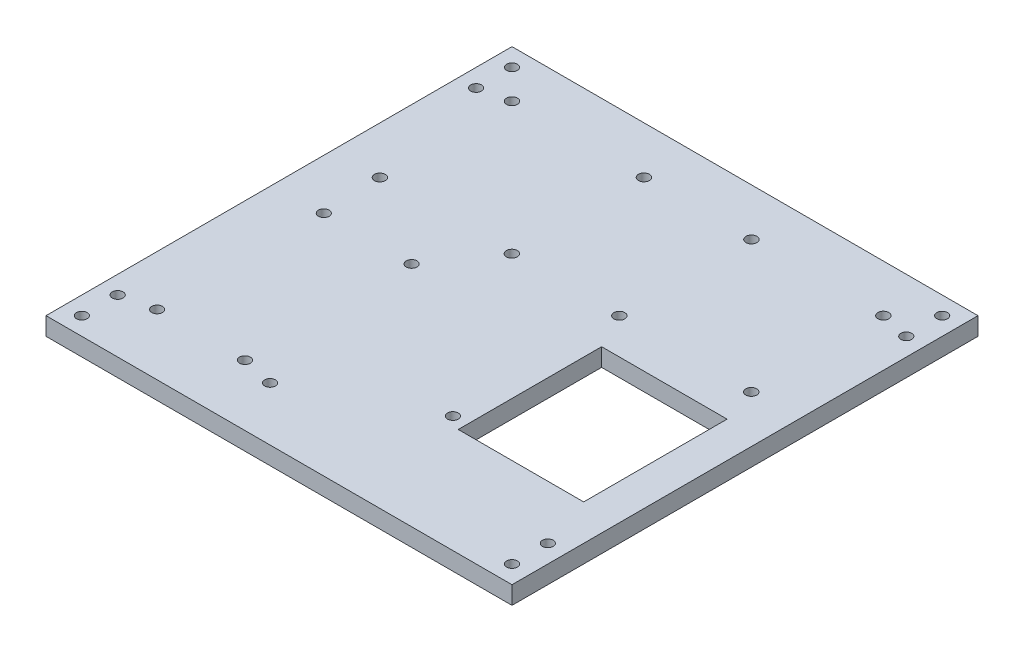
ISO-10303-21;
HEADER;
FILE_DESCRIPTION(('STEP AP214'),'2;1');
FILE_NAME('part.step','',(''),(''),'','','');
FILE_SCHEMA(('AUTOMOTIVE_DESIGN { 1 0 10303 214 1 1 1 1 }'));
ENDSEC;
DATA;
#1=APPLICATION_CONTEXT('core data for automotive mechanical design processes');
#2=APPLICATION_PROTOCOL_DEFINITION('international standard','automotive_design',2000,#1);
#3=PRODUCT_CONTEXT('',#1,'mechanical');
#4=PRODUCT('Part','Part','',(#3));
#5=PRODUCT_RELATED_PRODUCT_CATEGORY('part','',(#4));
#6=PRODUCT_DEFINITION_FORMATION('','',#4);
#7=PRODUCT_DEFINITION_CONTEXT('part definition',#1,'design');
#8=PRODUCT_DEFINITION('design','',#6,#7);
#9=PRODUCT_DEFINITION_SHAPE('','',#8);
#10=(LENGTH_UNIT() NAMED_UNIT(*) SI_UNIT(.MILLI.,.METRE.));
#11=(NAMED_UNIT(*) PLANE_ANGLE_UNIT() SI_UNIT($,.RADIAN.));
#12=(NAMED_UNIT(*) SI_UNIT($,.STERADIAN.) SOLID_ANGLE_UNIT());
#13=UNCERTAINTY_MEASURE_WITH_UNIT(LENGTH_MEASURE(1.E-05),#10,'distance_accuracy_value','');
#14=(GEOMETRIC_REPRESENTATION_CONTEXT(3) GLOBAL_UNCERTAINTY_ASSIGNED_CONTEXT((#13)) GLOBAL_UNIT_ASSIGNED_CONTEXT((#10,
#11,#12)) REPRESENTATION_CONTEXT('',''));
#15=CARTESIAN_POINT('',(0.,0.,0.));
#16=DIRECTION('',(0.,0.,1.));
#17=DIRECTION('',(1.,0.,0.));
#18=AXIS2_PLACEMENT_3D('',#15,#16,#17);
#19=CARTESIAN_POINT('',(65.,5.,-65.));
#20=DIRECTION('',(-1.,0.,0.));
#21=DIRECTION('',(0.,0.,1.));
#22=AXIS2_PLACEMENT_3D('',#19,#20,#21);
#23=PLANE('',#22);
#24=DIRECTION('',(0.,0.,-1.));
#25=VECTOR('',#24,1.);
#26=CARTESIAN_POINT('',(65.,0.,-65.));
#27=LINE('',#26,#25);
#28=CARTESIAN_POINT('',(65.,0.,65.));
#29=VERTEX_POINT('',#28);
#30=CARTESIAN_POINT('',(65.,0.,-65.));
#31=VERTEX_POINT('',#30);
#32=EDGE_CURVE('E176',#29,#31,#27,.T.);
#33=ORIENTED_EDGE('',*,*,#32,.T.);
#34=DIRECTION('',(0.,-1.,0.));
#35=VECTOR('',#34,1.);
#36=CARTESIAN_POINT('',(65.,5.,-65.));
#37=LINE('',#36,#35);
#38=CARTESIAN_POINT('',(65.,5.,-65.));
#39=VERTEX_POINT('',#38);
#40=EDGE_CURVE('E11',#39,#31,#37,.T.);
#41=ORIENTED_EDGE('',*,*,#40,.F.);
#42=DIRECTION('',(0.,0.,-1.));
#43=VECTOR('',#42,1.);
#44=CARTESIAN_POINT('',(65.,5.,-65.));
#45=LINE('',#44,#43);
#46=CARTESIAN_POINT('',(65.,5.,65.));
#47=VERTEX_POINT('',#46);
#48=EDGE_CURVE('E177',#47,#39,#45,.T.);
#49=ORIENTED_EDGE('',*,*,#48,.F.);
#50=DIRECTION('',(0.,-1.,0.));
#51=VECTOR('',#50,1.);
#52=CARTESIAN_POINT('',(65.,5.,65.));
#53=LINE('',#52,#51);
#54=EDGE_CURVE('E187',#47,#29,#53,.T.);
#55=ORIENTED_EDGE('',*,*,#54,.T.);
#56=EDGE_LOOP('',(#33,#41,#49,#55));
#57=FACE_BOUND('',#56,.T.);
#58=ADVANCED_FACE('F33',(#57),#23,.F.);
#59=CARTESIAN_POINT('',(-65.,5.,-65.));
#60=DIRECTION('',(0.,0.,1.));
#61=DIRECTION('',(1.,0.,0.));
#62=AXIS2_PLACEMENT_3D('',#59,#60,#61);
#63=PLANE('',#62);
#64=DIRECTION('',(-1.,0.,0.));
#65=VECTOR('',#64,1.);
#66=CARTESIAN_POINT('',(-65.,0.,-65.));
#67=LINE('',#66,#65);
#68=CARTESIAN_POINT('',(-65.,0.,-65.));
#69=VERTEX_POINT('',#68);
#70=EDGE_CURVE('E190',#31,#69,#67,.T.);
#71=ORIENTED_EDGE('',*,*,#70,.T.);
#72=DIRECTION('',(0.,-1.,0.));
#73=VECTOR('',#72,1.);
#74=CARTESIAN_POINT('',(-65.,5.,-65.));
#75=LINE('',#74,#73);
#76=CARTESIAN_POINT('',(-65.,5.,-65.));
#77=VERTEX_POINT('',#76);
#78=EDGE_CURVE('E40',#77,#69,#75,.T.);
#79=ORIENTED_EDGE('',*,*,#78,.F.);
#80=DIRECTION('',(-1.,0.,0.));
#81=VECTOR('',#80,1.);
#82=CARTESIAN_POINT('',(-65.,5.,-65.));
#83=LINE('',#82,#81);
#84=EDGE_CURVE('E180',#39,#77,#83,.T.);
#85=ORIENTED_EDGE('',*,*,#84,.F.);
#86=ORIENTED_EDGE('',*,*,#40,.T.);
#87=EDGE_LOOP('',(#71,#79,#85,#86));
#88=FACE_BOUND('',#87,.T.);
#89=ADVANCED_FACE('F219',(#88),#63,.F.);
#90=CARTESIAN_POINT('',(-65.,5.,-65.));
#91=DIRECTION('',(1.,0.,0.));
#92=DIRECTION('',(0.,0.,-1.));
#93=AXIS2_PLACEMENT_3D('',#90,#91,#92);
#94=PLANE('',#93);
#95=DIRECTION('',(0.,0.,1.));
#96=VECTOR('',#95,1.);
#97=CARTESIAN_POINT('',(-65.,0.,-65.));
#98=LINE('',#97,#96);
#99=CARTESIAN_POINT('',(-65.,0.,65.));
#100=VERTEX_POINT('',#99);
#101=EDGE_CURVE('E192',#69,#100,#98,.T.);
#102=ORIENTED_EDGE('',*,*,#101,.T.);
#103=DIRECTION('',(0.,-1.,0.));
#104=VECTOR('',#103,1.);
#105=CARTESIAN_POINT('',(-65.,5.,65.));
#106=LINE('',#105,#104);
#107=CARTESIAN_POINT('',(-65.,5.,65.));
#108=VERTEX_POINT('',#107);
#109=EDGE_CURVE('E197',#108,#100,#106,.T.);
#110=ORIENTED_EDGE('',*,*,#109,.F.);
#111=DIRECTION('',(0.,0.,1.));
#112=VECTOR('',#111,1.);
#113=CARTESIAN_POINT('',(-65.,5.,-65.));
#114=LINE('',#113,#112);
#115=EDGE_CURVE('E183',#77,#108,#114,.T.);
#116=ORIENTED_EDGE('',*,*,#115,.F.);
#117=ORIENTED_EDGE('',*,*,#78,.T.);
#118=EDGE_LOOP('',(#102,#110,#116,#117));
#119=FACE_BOUND('',#118,.T.);
#120=ADVANCED_FACE('F204',(#119),#94,.F.);
#121=CARTESIAN_POINT('',(-65.,5.,65.));
#122=DIRECTION('',(0.,0.,-1.));
#123=DIRECTION('',(-1.,0.,0.));
#124=AXIS2_PLACEMENT_3D('',#121,#122,#123);
#125=PLANE('',#124);
#126=DIRECTION('',(1.,0.,0.));
#127=VECTOR('',#126,1.);
#128=CARTESIAN_POINT('',(-65.,0.,65.));
#129=LINE('',#128,#127);
#130=EDGE_CURVE('E181',#100,#29,#129,.T.);
#131=ORIENTED_EDGE('',*,*,#130,.T.);
#132=ORIENTED_EDGE('',*,*,#54,.F.);
#133=DIRECTION('',(1.,0.,0.));
#134=VECTOR('',#133,1.);
#135=CARTESIAN_POINT('',(-65.,5.,65.));
#136=LINE('',#135,#134);
#137=EDGE_CURVE('E185',#108,#47,#136,.T.);
#138=ORIENTED_EDGE('',*,*,#137,.F.);
#139=ORIENTED_EDGE('',*,*,#109,.T.);
#140=EDGE_LOOP('',(#131,#132,#138,#139));
#141=FACE_BOUND('',#140,.T.);
#142=ADVANCED_FACE('F213',(#141),#125,.F.);
#143=CARTESIAN_POINT('',(0.,5.,0.));
#144=DIRECTION('',(0.,1.,0.));
#145=DIRECTION('',(0.,0.,1.));
#146=AXIS2_PLACEMENT_3D('',#143,#144,#145);
#147=PLANE('',#146);
#148=CARTESIAN_POINT('',(16.,5.,32.5));
#149=DIRECTION('',(0.,1.,0.));
#150=DIRECTION('',(0.,0.,1.));
#151=AXIS2_PLACEMENT_3D('',#148,#149,#150);
#152=CIRCLE('',#151,1.5);
#153=CARTESIAN_POINT('',(16.,5.,34.));
#154=VERTEX_POINT('',#153);
#155=EDGE_CURVE('E341',#154,#154,#152,.T.);
#156=ORIENTED_EDGE('',*,*,#155,.F.);
#157=EDGE_LOOP('',(#156));
#158=FACE_BOUND('',#157,.T.);
#159=CARTESIAN_POINT('',(-51.,5.,1.49999999999999));
#160=DIRECTION('',(0.,1.,0.));
#161=DIRECTION('',(0.,0.,1.));
#162=AXIS2_PLACEMENT_3D('',#159,#160,#161);
#163=CIRCLE('',#162,1.5);
#164=CARTESIAN_POINT('',(-51.,5.,2.99999999999999));
#165=VERTEX_POINT('',#164);
#166=EDGE_CURVE('E353',#165,#165,#163,.T.);
#167=ORIENTED_EDGE('',*,*,#166,.F.);
#168=EDGE_LOOP('',(#167));
#169=FACE_BOUND('',#168,.T.);
#170=CARTESIAN_POINT('',(-51.8036994219653,5.,-14.95));
#171=DIRECTION('',(0.,1.,0.));
#172=DIRECTION('',(0.,0.,1.));
#173=AXIS2_PLACEMENT_3D('',#170,#171,#172);
#174=CIRCLE('',#173,1.525);
#175=CARTESIAN_POINT('',(-51.8036994219653,5.,-13.425));
#176=VERTEX_POINT('',#175);
#177=EDGE_CURVE('E378',#176,#176,#174,.T.);
#178=ORIENTED_EDGE('',*,*,#177,.F.);
#179=EDGE_LOOP('',(#178));
#180=FACE_BOUND('',#179,.T.);
#181=CARTESIAN_POINT('',(-14.9963005780347,5.,-14.95));
#182=DIRECTION('',(0.,1.,0.));
#183=DIRECTION('',(0.,0.,1.));
#184=AXIS2_PLACEMENT_3D('',#181,#182,#183);
#185=CIRCLE('',#184,1.525);
#186=CARTESIAN_POINT('',(-14.9963005780347,5.,-13.425));
#187=VERTEX_POINT('',#186);
#188=EDGE_CURVE('E372',#187,#187,#185,.T.);
#189=ORIENTED_EDGE('',*,*,#188,.F.);
#190=EDGE_LOOP('',(#189));
#191=FACE_BOUND('',#190,.T.);
#192=CARTESIAN_POINT('',(14.9963005780347,5.,-14.9499999999999));
#193=DIRECTION('',(0.,1.,0.));
#194=DIRECTION('',(0.,0.,1.));
#195=AXIS2_PLACEMENT_3D('',#192,#193,#194);
#196=CIRCLE('',#195,1.525);
#197=CARTESIAN_POINT('',(14.9963005780347,5.,-13.4249999999999));
#198=VERTEX_POINT('',#197);
#199=EDGE_CURVE('E364',#198,#198,#196,.T.);
#200=ORIENTED_EDGE('',*,*,#199,.F.);
#201=EDGE_LOOP('',(#200));
#202=FACE_BOUND('',#201,.T.);
#203=CARTESIAN_POINT('',(51.8036994219653,5.,-14.9499999999999));
#204=DIRECTION('',(0.,1.,0.));
#205=DIRECTION('',(0.,0.,1.));
#206=AXIS2_PLACEMENT_3D('',#203,#204,#205);
#207=CIRCLE('',#206,1.525);
#208=CARTESIAN_POINT('',(51.8036994219653,5.,-13.425));
#209=VERTEX_POINT('',#208);
#210=EDGE_CURVE('E371',#209,#209,#207,.T.);
#211=ORIENTED_EDGE('',*,*,#210,.F.);
#212=EDGE_LOOP('',(#211));
#213=FACE_BOUND('',#212,.T.);
#214=CARTESIAN_POINT('',(51.8036994219653,5.,-51.7999999999999));
#215=DIRECTION('',(0.,1.,0.));
#216=DIRECTION('',(0.,0.,1.));
#217=AXIS2_PLACEMENT_3D('',#214,#215,#216);
#218=CIRCLE('',#217,1.525);
#219=CARTESIAN_POINT('',(51.8036994219653,5.,-50.2749999999999));
#220=VERTEX_POINT('',#219);
#221=EDGE_CURVE('E402',#220,#220,#218,.T.);
#222=ORIENTED_EDGE('',*,*,#221,.F.);
#223=EDGE_LOOP('',(#222));
#224=FACE_BOUND('',#223,.T.);
#225=CARTESIAN_POINT('',(14.9963005780347,5.,-51.7999999999999));
#226=DIRECTION('',(0.,1.,0.));
#227=DIRECTION('',(0.,0.,1.));
#228=AXIS2_PLACEMENT_3D('',#225,#226,#227);
#229=CIRCLE('',#228,1.525);
#230=CARTESIAN_POINT('',(14.9963005780347,5.,-50.2749999999999));
#231=VERTEX_POINT('',#230);
#232=EDGE_CURVE('E396',#231,#231,#229,.T.);
#233=ORIENTED_EDGE('',*,*,#232,.F.);
#234=EDGE_LOOP('',(#233));
#235=FACE_BOUND('',#234,.T.);
#236=CARTESIAN_POINT('',(-14.9963005780347,5.,-51.8));
#237=DIRECTION('',(0.,1.,0.));
#238=DIRECTION('',(0.,0.,1.));
#239=AXIS2_PLACEMENT_3D('',#236,#237,#238);
#240=CIRCLE('',#239,1.525);
#241=CARTESIAN_POINT('',(-14.9963005780347,5.,-50.275));
#242=VERTEX_POINT('',#241);
#243=EDGE_CURVE('E388',#242,#242,#240,.T.);
#244=ORIENTED_EDGE('',*,*,#243,.F.);
#245=EDGE_LOOP('',(#244));
#246=FACE_BOUND('',#245,.T.);
#247=CARTESIAN_POINT('',(-26.5,5.,1.49999999999999));
#248=DIRECTION('',(0.,1.,0.));
#249=DIRECTION('',(0.,0.,1.));
#250=AXIS2_PLACEMENT_3D('',#247,#248,#249);
#251=CIRCLE('',#250,1.5);
#252=CARTESIAN_POINT('',(-26.5,5.,3.));
#253=VERTEX_POINT('',#252);
#254=EDGE_CURVE('E346',#253,#253,#251,.T.);
#255=ORIENTED_EDGE('',*,*,#254,.F.);
#256=EDGE_LOOP('',(#255));
#257=FACE_BOUND('',#256,.T.);
#258=CARTESIAN_POINT('',(-26.5,5.,48.));
#259=DIRECTION('',(0.,1.,0.));
#260=DIRECTION('',(0.,0.,1.));
#261=AXIS2_PLACEMENT_3D('',#258,#259,#260);
#262=CIRCLE('',#261,1.5);
#263=CARTESIAN_POINT('',(-26.5,5.,49.5));
#264=VERTEX_POINT('',#263);
#265=EDGE_CURVE('E354',#264,#264,#262,.T.);
#266=ORIENTED_EDGE('',*,*,#265,.F.);
#267=EDGE_LOOP('',(#266));
#268=FACE_BOUND('',#267,.T.);
#269=CARTESIAN_POINT('',(-51.,5.,48.));
#270=DIRECTION('',(0.,1.,0.));
#271=DIRECTION('',(0.,0.,1.));
#272=AXIS2_PLACEMENT_3D('',#269,#270,#271);
#273=CIRCLE('',#272,1.49999999999998);
#274=CARTESIAN_POINT('',(-51.,5.,49.5));
#275=VERTEX_POINT('',#274);
#276=EDGE_CURVE('E343',#275,#275,#273,.T.);
#277=ORIENTED_EDGE('',*,*,#276,.F.);
#278=EDGE_LOOP('',(#277));
#279=FACE_BOUND('',#278,.T.);
#280=CARTESIAN_POINT('',(-51.8036994219653,5.,-51.8));
#281=DIRECTION('',(0.,1.,0.));
#282=DIRECTION('',(0.,0.,1.));
#283=AXIS2_PLACEMENT_3D('',#280,#281,#282);
#284=CIRCLE('',#283,1.525);
#285=CARTESIAN_POINT('',(-51.8036994219653,5.,-50.275));
#286=VERTEX_POINT('',#285);
#287=EDGE_CURVE('E395',#286,#286,#284,.T.);
#288=ORIENTED_EDGE('',*,*,#287,.F.);
#289=EDGE_LOOP('',(#288));
#290=FACE_BOUND('',#289,.T.);
#291=CARTESIAN_POINT('',(-17.5,5.,50.));
#292=DIRECTION('',(0.,1.,0.));
#293=DIRECTION('',(0.,0.,1.));
#294=AXIS2_PLACEMENT_3D('',#291,#292,#293);
#295=CIRCLE('',#294,1.5);
#296=CARTESIAN_POINT('',(-17.5,5.,51.5));
#297=VERTEX_POINT('',#296);
#298=EDGE_CURVE('E417',#297,#297,#295,.T.);
#299=ORIENTED_EDGE('',*,*,#298,.F.);
#300=EDGE_LOOP('',(#299));
#301=FACE_BOUND('',#300,.T.);
#302=DIRECTION('',(0.,0.,-1.));
#303=VECTOR('',#302,1.);
#304=CARTESIAN_POINT('',(55.,5.,-5.));
#305=LINE('',#304,#303);
#306=CARTESIAN_POINT('',(55.,5.,35.));
#307=VERTEX_POINT('',#306);
#308=CARTESIAN_POINT('',(55.,5.,-5.));
#309=VERTEX_POINT('',#308);
#310=EDGE_CURVE('E47',#307,#309,#305,.T.);
#311=ORIENTED_EDGE('',*,*,#310,.F.);
#312=DIRECTION('',(1.,0.,0.));
#313=VECTOR('',#312,1.);
#314=CARTESIAN_POINT('',(20.,5.,35.));
#315=LINE('',#314,#313);
#316=CARTESIAN_POINT('',(20.,5.,35.));
#317=VERTEX_POINT('',#316);
#318=EDGE_CURVE('E116',#317,#307,#315,.T.);
#319=ORIENTED_EDGE('',*,*,#318,.F.);
#320=DIRECTION('',(0.,0.,1.));
#321=VECTOR('',#320,1.);
#322=CARTESIAN_POINT('',(20.,5.,-5.));
#323=LINE('',#322,#321);
#324=CARTESIAN_POINT('',(20.,5.,-5.));
#325=VERTEX_POINT('',#324);
#326=EDGE_CURVE('E100',#325,#317,#323,.T.);
#327=ORIENTED_EDGE('',*,*,#326,.F.);
#328=DIRECTION('',(-1.,0.,0.));
#329=VECTOR('',#328,1.);
#330=CARTESIAN_POINT('',(20.,5.,-5.));
#331=LINE('',#330,#329);
#332=EDGE_CURVE('E109',#309,#325,#331,.T.);
#333=ORIENTED_EDGE('',*,*,#332,.F.);
#334=EDGE_LOOP('',(#311,#319,#327,#333));
#335=FACE_BOUND('',#334,.T.);
#336=CARTESIAN_POINT('',(-60.,5.,50.));
#337=DIRECTION('',(0.,1.,0.));
#338=DIRECTION('',(0.,0.,1.));
#339=AXIS2_PLACEMENT_3D('',#336,#337,#338);
#340=CIRCLE('',#339,1.49999999999999);
#341=CARTESIAN_POINT('',(-60.,5.,51.5));
#342=VERTEX_POINT('',#341);
#343=EDGE_CURVE('E127',#342,#342,#340,.T.);
#344=ORIENTED_EDGE('',*,*,#343,.F.);
#345=EDGE_LOOP('',(#344));
#346=FACE_BOUND('',#345,.T.);
#347=CARTESIAN_POINT('',(60.,5.,50.));
#348=DIRECTION('',(0.,1.,0.));
#349=DIRECTION('',(0.,0.,1.));
#350=AXIS2_PLACEMENT_3D('',#347,#348,#349);
#351=CIRCLE('',#350,1.5);
#352=CARTESIAN_POINT('',(60.,5.,51.5));
#353=VERTEX_POINT('',#352);
#354=EDGE_CURVE('E137',#353,#353,#351,.T.);
#355=ORIENTED_EDGE('',*,*,#354,.F.);
#356=EDGE_LOOP('',(#355));
#357=FACE_BOUND('',#356,.T.);
#358=CARTESIAN_POINT('',(60.,5.,-50.));
#359=DIRECTION('',(0.,1.,0.));
#360=DIRECTION('',(0.,0.,1.));
#361=AXIS2_PLACEMENT_3D('',#358,#359,#360);
#362=CIRCLE('',#361,1.5);
#363=CARTESIAN_POINT('',(60.,5.,-48.5));
#364=VERTEX_POINT('',#363);
#365=EDGE_CURVE('E129',#364,#364,#362,.T.);
#366=ORIENTED_EDGE('',*,*,#365,.F.);
#367=EDGE_LOOP('',(#366));
#368=FACE_BOUND('',#367,.T.);
#369=CARTESIAN_POINT('',(-60.,5.,-50.));
#370=DIRECTION('',(0.,1.,0.));
#371=DIRECTION('',(0.,0.,1.));
#372=AXIS2_PLACEMENT_3D('',#369,#370,#371);
#373=CIRCLE('',#372,1.49999999999999);
#374=CARTESIAN_POINT('',(-60.,5.,-48.5));
#375=VERTEX_POINT('',#374);
#376=EDGE_CURVE('E136',#375,#375,#373,.T.);
#377=ORIENTED_EDGE('',*,*,#376,.F.);
#378=EDGE_LOOP('',(#377));
#379=FACE_BOUND('',#378,.T.);
#380=CARTESIAN_POINT('',(-60.,5.,-60.));
#381=DIRECTION('',(0.,1.,0.));
#382=DIRECTION('',(0.,0.,-1.));
#383=AXIS2_PLACEMENT_3D('',#380,#381,#382);
#384=CIRCLE('',#383,1.5);
#385=CARTESIAN_POINT('',(-60.,5.,-61.5));
#386=VERTEX_POINT('',#385);
#387=EDGE_CURVE('E152',#386,#386,#384,.T.);
#388=ORIENTED_EDGE('',*,*,#387,.F.);
#389=EDGE_LOOP('',(#388));
#390=FACE_BOUND('',#389,.T.);
#391=CARTESIAN_POINT('',(-60.,5.,60.));
#392=DIRECTION('',(0.,1.,0.));
#393=DIRECTION('',(0.,0.,1.));
#394=AXIS2_PLACEMENT_3D('',#391,#392,#393);
#395=CIRCLE('',#394,1.5);
#396=CARTESIAN_POINT('',(-60.,5.,61.5));
#397=VERTEX_POINT('',#396);
#398=EDGE_CURVE('E161',#397,#397,#395,.T.);
#399=ORIENTED_EDGE('',*,*,#398,.F.);
#400=EDGE_LOOP('',(#399));
#401=FACE_BOUND('',#400,.T.);
#402=CARTESIAN_POINT('',(60.,5.,60.));
#403=DIRECTION('',(0.,1.,0.));
#404=DIRECTION('',(0.,0.,-1.));
#405=AXIS2_PLACEMENT_3D('',#402,#403,#404);
#406=CIRCLE('',#405,1.5);
#407=CARTESIAN_POINT('',(60.,5.,58.5));
#408=VERTEX_POINT('',#407);
#409=EDGE_CURVE('E153',#408,#408,#406,.T.);
#410=ORIENTED_EDGE('',*,*,#409,.F.);
#411=EDGE_LOOP('',(#410));
#412=FACE_BOUND('',#411,.T.);
#413=CARTESIAN_POINT('',(60.,5.,-60.));
#414=DIRECTION('',(0.,1.,0.));
#415=DIRECTION('',(0.,0.,1.));
#416=AXIS2_PLACEMENT_3D('',#413,#414,#415);
#417=CIRCLE('',#416,1.5);
#418=CARTESIAN_POINT('',(60.,5.,-58.5));
#419=VERTEX_POINT('',#418);
#420=EDGE_CURVE('E160',#419,#419,#417,.T.);
#421=ORIENTED_EDGE('',*,*,#420,.F.);
#422=EDGE_LOOP('',(#421));
#423=FACE_BOUND('',#422,.T.);
#424=ORIENTED_EDGE('',*,*,#48,.T.);
#425=ORIENTED_EDGE('',*,*,#84,.T.);
#426=ORIENTED_EDGE('',*,*,#115,.T.);
#427=ORIENTED_EDGE('',*,*,#137,.T.);
#428=EDGE_LOOP('',(#424,#425,#426,#427));
#429=FACE_BOUND('',#428,.T.);
#430=ADVANCED_FACE('F113',(#158,#169,#180,#191,#202,#213,#224,#235,#246,#257,#268,#279,#290,
#301,#335,#346,#357,#368,#379,#390,#401,#412,#423,#429),#147,.T.);
#431=CARTESIAN_POINT('',(0.,0.,0.));
#432=DIRECTION('',(0.,1.,0.));
#433=DIRECTION('',(0.,0.,1.));
#434=AXIS2_PLACEMENT_3D('',#431,#432,#433);
#435=PLANE('',#434);
#436=CARTESIAN_POINT('',(16.,0.,32.5));
#437=DIRECTION('',(0.,1.,0.));
#438=DIRECTION('',(0.,0.,1.));
#439=AXIS2_PLACEMENT_3D('',#436,#437,#438);
#440=CIRCLE('',#439,1.5);
#441=CARTESIAN_POINT('',(16.,0.,34.));
#442=VERTEX_POINT('',#441);
#443=EDGE_CURVE('E338',#442,#442,#440,.F.);
#444=ORIENTED_EDGE('',*,*,#443,.F.);
#445=EDGE_LOOP('',(#444));
#446=FACE_BOUND('',#445,.T.);
#447=CARTESIAN_POINT('',(-51.,0.,1.49999999999999));
#448=DIRECTION('',(0.,1.,0.));
#449=DIRECTION('',(0.,0.,1.));
#450=AXIS2_PLACEMENT_3D('',#447,#448,#449);
#451=CIRCLE('',#450,1.5);
#452=CARTESIAN_POINT('',(-51.,0.,2.99999999999999));
#453=VERTEX_POINT('',#452);
#454=EDGE_CURVE('E381',#453,#453,#451,.F.);
#455=ORIENTED_EDGE('',*,*,#454,.F.);
#456=EDGE_LOOP('',(#455));
#457=FACE_BOUND('',#456,.T.);
#458=CARTESIAN_POINT('',(-51.8036994219653,0.,-14.95));
#459=DIRECTION('',(0.,1.,0.));
#460=DIRECTION('',(0.,0.,1.));
#461=AXIS2_PLACEMENT_3D('',#458,#459,#460);
#462=CIRCLE('',#461,1.525);
#463=CARTESIAN_POINT('',(-51.8036994219653,0.,-13.425));
#464=VERTEX_POINT('',#463);
#465=EDGE_CURVE('E375',#464,#464,#462,.F.);
#466=ORIENTED_EDGE('',*,*,#465,.F.);
#467=EDGE_LOOP('',(#466));
#468=FACE_BOUND('',#467,.T.);
#469=CARTESIAN_POINT('',(-14.9963005780347,0.,-14.95));
#470=DIRECTION('',(0.,1.,0.));
#471=DIRECTION('',(0.,0.,1.));
#472=AXIS2_PLACEMENT_3D('',#469,#470,#471);
#473=CIRCLE('',#472,1.525);
#474=CARTESIAN_POINT('',(-14.9963005780347,0.,-13.425));
#475=VERTEX_POINT('',#474);
#476=EDGE_CURVE('E368',#475,#475,#473,.F.);
#477=ORIENTED_EDGE('',*,*,#476,.F.);
#478=EDGE_LOOP('',(#477));
#479=FACE_BOUND('',#478,.T.);
#480=CARTESIAN_POINT('',(14.9963005780347,0.,-14.9499999999999));
#481=DIRECTION('',(0.,1.,0.));
#482=DIRECTION('',(0.,0.,1.));
#483=AXIS2_PLACEMENT_3D('',#480,#481,#482);
#484=CIRCLE('',#483,1.525);
#485=CARTESIAN_POINT('',(14.9963005780347,0.,-13.4249999999999));
#486=VERTEX_POINT('',#485);
#487=EDGE_CURVE('E367',#486,#486,#484,.F.);
#488=ORIENTED_EDGE('',*,*,#487,.F.);
#489=EDGE_LOOP('',(#488));
#490=FACE_BOUND('',#489,.T.);
#491=CARTESIAN_POINT('',(51.8036994219653,0.,-14.9499999999999));
#492=DIRECTION('',(0.,1.,0.));
#493=DIRECTION('',(0.,0.,1.));
#494=AXIS2_PLACEMENT_3D('',#491,#492,#493);
#495=CIRCLE('',#494,1.525);
#496=CARTESIAN_POINT('',(51.8036994219653,0.,-13.425));
#497=VERTEX_POINT('',#496);
#498=EDGE_CURVE('E405',#497,#497,#495,.F.);
#499=ORIENTED_EDGE('',*,*,#498,.F.);
#500=EDGE_LOOP('',(#499));
#501=FACE_BOUND('',#500,.T.);
#502=CARTESIAN_POINT('',(51.8036994219653,0.,-51.7999999999999));
#503=DIRECTION('',(0.,1.,0.));
#504=DIRECTION('',(0.,0.,1.));
#505=AXIS2_PLACEMENT_3D('',#502,#503,#504);
#506=CIRCLE('',#505,1.525);
#507=CARTESIAN_POINT('',(51.8036994219653,0.,-50.2749999999999));
#508=VERTEX_POINT('',#507);
#509=EDGE_CURVE('E399',#508,#508,#506,.F.);
#510=ORIENTED_EDGE('',*,*,#509,.F.);
#511=EDGE_LOOP('',(#510));
#512=FACE_BOUND('',#511,.T.);
#513=CARTESIAN_POINT('',(14.9963005780347,0.,-51.7999999999999));
#514=DIRECTION('',(0.,1.,0.));
#515=DIRECTION('',(0.,0.,1.));
#516=AXIS2_PLACEMENT_3D('',#513,#514,#515);
#517=CIRCLE('',#516,1.525);
#518=CARTESIAN_POINT('',(14.9963005780347,0.,-50.2749999999999));
#519=VERTEX_POINT('',#518);
#520=EDGE_CURVE('E392',#519,#519,#517,.F.);
#521=ORIENTED_EDGE('',*,*,#520,.F.);
#522=EDGE_LOOP('',(#521));
#523=FACE_BOUND('',#522,.T.);
#524=CARTESIAN_POINT('',(-14.9963005780347,0.,-51.8));
#525=DIRECTION('',(0.,1.,0.));
#526=DIRECTION('',(0.,0.,1.));
#527=AXIS2_PLACEMENT_3D('',#524,#525,#526);
#528=CIRCLE('',#527,1.525);
#529=CARTESIAN_POINT('',(-14.9963005780347,0.,-50.275));
#530=VERTEX_POINT('',#529);
#531=EDGE_CURVE('E391',#530,#530,#528,.F.);
#532=ORIENTED_EDGE('',*,*,#531,.F.);
#533=EDGE_LOOP('',(#532));
#534=FACE_BOUND('',#533,.T.);
#535=CARTESIAN_POINT('',(-26.5,0.,1.49999999999999));
#536=DIRECTION('',(0.,1.,0.));
#537=DIRECTION('',(0.,0.,1.));
#538=AXIS2_PLACEMENT_3D('',#535,#536,#537);
#539=CIRCLE('',#538,1.5);
#540=CARTESIAN_POINT('',(-26.5,0.,3.));
#541=VERTEX_POINT('',#540);
#542=EDGE_CURVE('E349',#541,#541,#539,.F.);
#543=ORIENTED_EDGE('',*,*,#542,.F.);
#544=EDGE_LOOP('',(#543));
#545=FACE_BOUND('',#544,.T.);
#546=CARTESIAN_POINT('',(-26.5,0.,48.));
#547=DIRECTION('',(0.,1.,0.));
#548=DIRECTION('',(0.,0.,1.));
#549=AXIS2_PLACEMENT_3D('',#546,#547,#548);
#550=CIRCLE('',#549,1.5);
#551=CARTESIAN_POINT('',(-26.5,0.,49.5));
#552=VERTEX_POINT('',#551);
#553=EDGE_CURVE('E350',#552,#552,#550,.F.);
#554=ORIENTED_EDGE('',*,*,#553,.F.);
#555=EDGE_LOOP('',(#554));
#556=FACE_BOUND('',#555,.T.);
#557=CARTESIAN_POINT('',(-51.,0.,48.));
#558=DIRECTION('',(0.,1.,0.));
#559=DIRECTION('',(0.,0.,1.));
#560=AXIS2_PLACEMENT_3D('',#557,#558,#559);
#561=CIRCLE('',#560,1.49999999999998);
#562=CARTESIAN_POINT('',(-51.,0.,49.5));
#563=VERTEX_POINT('',#562);
#564=EDGE_CURVE('E357',#563,#563,#561,.F.);
#565=ORIENTED_EDGE('',*,*,#564,.F.);
#566=EDGE_LOOP('',(#565));
#567=FACE_BOUND('',#566,.T.);
#568=CARTESIAN_POINT('',(-51.8036994219653,0.,-51.8));
#569=DIRECTION('',(0.,1.,0.));
#570=DIRECTION('',(0.,0.,1.));
#571=AXIS2_PLACEMENT_3D('',#568,#569,#570);
#572=CIRCLE('',#571,1.525);
#573=CARTESIAN_POINT('',(-51.8036994219653,0.,-50.275));
#574=VERTEX_POINT('',#573);
#575=EDGE_CURVE('E414',#574,#574,#572,.F.);
#576=ORIENTED_EDGE('',*,*,#575,.F.);
#577=EDGE_LOOP('',(#576));
#578=FACE_BOUND('',#577,.T.);
#579=CARTESIAN_POINT('',(-17.5,0.,50.));
#580=DIRECTION('',(0.,1.,0.));
#581=DIRECTION('',(0.,0.,1.));
#582=AXIS2_PLACEMENT_3D('',#579,#580,#581);
#583=CIRCLE('',#582,1.5);
#584=CARTESIAN_POINT('',(-17.5,0.,51.5));
#585=VERTEX_POINT('',#584);
#586=EDGE_CURVE('E420',#585,#585,#583,.F.);
#587=ORIENTED_EDGE('',*,*,#586,.F.);
#588=EDGE_LOOP('',(#587));
#589=FACE_BOUND('',#588,.T.);
#590=DIRECTION('',(-1.,0.,0.));
#591=VECTOR('',#590,1.);
#592=CARTESIAN_POINT('',(20.,0.,35.));
#593=LINE('',#592,#591);
#594=CARTESIAN_POINT('',(55.,0.,35.));
#595=VERTEX_POINT('',#594);
#596=CARTESIAN_POINT('',(20.,0.,35.));
#597=VERTEX_POINT('',#596);
#598=EDGE_CURVE('E424',#595,#597,#593,.T.);
#599=ORIENTED_EDGE('',*,*,#598,.F.);
#600=DIRECTION('',(0.,0.,1.));
#601=VECTOR('',#600,1.);
#602=CARTESIAN_POINT('',(55.,0.,-5.));
#603=LINE('',#602,#601);
#604=CARTESIAN_POINT('',(55.,0.,-5.));
#605=VERTEX_POINT('',#604);
#606=EDGE_CURVE('E128',#605,#595,#603,.T.);
#607=ORIENTED_EDGE('',*,*,#606,.F.);
#608=DIRECTION('',(1.,0.,0.));
#609=VECTOR('',#608,1.);
#610=CARTESIAN_POINT('',(20.,0.,-5.));
#611=LINE('',#610,#609);
#612=CARTESIAN_POINT('',(20.,0.,-5.));
#613=VERTEX_POINT('',#612);
#614=EDGE_CURVE('E125',#613,#605,#611,.T.);
#615=ORIENTED_EDGE('',*,*,#614,.F.);
#616=DIRECTION('',(0.,0.,-1.));
#617=VECTOR('',#616,1.);
#618=CARTESIAN_POINT('',(20.,0.,-5.));
#619=LINE('',#618,#617);
#620=EDGE_CURVE('E103',#597,#613,#619,.T.);
#621=ORIENTED_EDGE('',*,*,#620,.F.);
#622=EDGE_LOOP('',(#599,#607,#615,#621));
#623=FACE_BOUND('',#622,.T.);
#624=CARTESIAN_POINT('',(-60.,0.,50.));
#625=DIRECTION('',(0.,1.,0.));
#626=DIRECTION('',(0.,0.,1.));
#627=AXIS2_PLACEMENT_3D('',#624,#625,#626);
#628=CIRCLE('',#627,1.49999999999999);
#629=CARTESIAN_POINT('',(-60.,0.,51.5));
#630=VERTEX_POINT('',#629);
#631=EDGE_CURVE('E140',#630,#630,#628,.F.);
#632=ORIENTED_EDGE('',*,*,#631,.F.);
#633=EDGE_LOOP('',(#632));
#634=FACE_BOUND('',#633,.T.);
#635=CARTESIAN_POINT('',(60.,0.,50.));
#636=DIRECTION('',(0.,1.,0.));
#637=DIRECTION('',(0.,0.,1.));
#638=AXIS2_PLACEMENT_3D('',#635,#636,#637);
#639=CIRCLE('',#638,1.5);
#640=CARTESIAN_POINT('',(60.,0.,51.5));
#641=VERTEX_POINT('',#640);
#642=EDGE_CURVE('E133',#641,#641,#639,.F.);
#643=ORIENTED_EDGE('',*,*,#642,.F.);
#644=EDGE_LOOP('',(#643));
#645=FACE_BOUND('',#644,.T.);
#646=CARTESIAN_POINT('',(60.,0.,-50.));
#647=DIRECTION('',(0.,1.,0.));
#648=DIRECTION('',(0.,0.,1.));
#649=AXIS2_PLACEMENT_3D('',#646,#647,#648);
#650=CIRCLE('',#649,1.5);
#651=CARTESIAN_POINT('',(60.,0.,-48.5));
#652=VERTEX_POINT('',#651);
#653=EDGE_CURVE('E132',#652,#652,#650,.F.);
#654=ORIENTED_EDGE('',*,*,#653,.F.);
#655=EDGE_LOOP('',(#654));
#656=FACE_BOUND('',#655,.T.);
#657=CARTESIAN_POINT('',(-60.,0.,-50.));
#658=DIRECTION('',(0.,1.,0.));
#659=DIRECTION('',(0.,0.,1.));
#660=AXIS2_PLACEMENT_3D('',#657,#658,#659);
#661=CIRCLE('',#660,1.49999999999999);
#662=CARTESIAN_POINT('',(-60.,0.,-48.5));
#663=VERTEX_POINT('',#662);
#664=EDGE_CURVE('E149',#663,#663,#661,.F.);
#665=ORIENTED_EDGE('',*,*,#664,.F.);
#666=EDGE_LOOP('',(#665));
#667=FACE_BOUND('',#666,.T.);
#668=CARTESIAN_POINT('',(-60.,0.,-60.));
#669=DIRECTION('',(0.,1.,0.));
#670=DIRECTION('',(0.,0.,1.));
#671=AXIS2_PLACEMENT_3D('',#668,#669,#670);
#672=CIRCLE('',#671,1.5);
#673=CARTESIAN_POINT('',(-60.,0.,-58.5));
#674=VERTEX_POINT('',#673);
#675=EDGE_CURVE('E164',#674,#674,#672,.F.);
#676=ORIENTED_EDGE('',*,*,#675,.F.);
#677=EDGE_LOOP('',(#676));
#678=FACE_BOUND('',#677,.T.);
#679=CARTESIAN_POINT('',(-60.,0.,60.));
#680=DIRECTION('',(0.,1.,0.));
#681=DIRECTION('',(0.,0.,1.));
#682=AXIS2_PLACEMENT_3D('',#679,#680,#681);
#683=CIRCLE('',#682,1.5);
#684=CARTESIAN_POINT('',(-60.,0.,61.5));
#685=VERTEX_POINT('',#684);
#686=EDGE_CURVE('E157',#685,#685,#683,.F.);
#687=ORIENTED_EDGE('',*,*,#686,.F.);
#688=EDGE_LOOP('',(#687));
#689=FACE_BOUND('',#688,.T.);
#690=CARTESIAN_POINT('',(60.,0.,60.));
#691=DIRECTION('',(0.,1.,0.));
#692=DIRECTION('',(0.,0.,1.));
#693=AXIS2_PLACEMENT_3D('',#690,#691,#692);
#694=CIRCLE('',#693,1.5);
#695=CARTESIAN_POINT('',(60.,0.,61.5));
#696=VERTEX_POINT('',#695);
#697=EDGE_CURVE('E156',#696,#696,#694,.F.);
#698=ORIENTED_EDGE('',*,*,#697,.F.);
#699=EDGE_LOOP('',(#698));
#700=FACE_BOUND('',#699,.T.);
#701=CARTESIAN_POINT('',(60.,0.,-60.));
#702=DIRECTION('',(0.,1.,0.));
#703=DIRECTION('',(0.,0.,1.));
#704=AXIS2_PLACEMENT_3D('',#701,#702,#703);
#705=CIRCLE('',#704,1.5);
#706=CARTESIAN_POINT('',(60.,0.,-58.5));
#707=VERTEX_POINT('',#706);
#708=EDGE_CURVE('E173',#707,#707,#705,.F.);
#709=ORIENTED_EDGE('',*,*,#708,.F.);
#710=EDGE_LOOP('',(#709));
#711=FACE_BOUND('',#710,.T.);
#712=ORIENTED_EDGE('',*,*,#32,.F.);
#713=ORIENTED_EDGE('',*,*,#130,.F.);
#714=ORIENTED_EDGE('',*,*,#101,.F.);
#715=ORIENTED_EDGE('',*,*,#70,.F.);
#716=EDGE_LOOP('',(#712,#713,#714,#715));
#717=FACE_BOUND('',#716,.T.);
#718=ADVANCED_FACE('F210',(#446,#457,#468,#479,#490,#501,#512,#523,#534,#545,#556,#567,#578,
#589,#623,#634,#645,#656,#667,#678,#689,#700,#711,#717),#435,.F.);
#719=CARTESIAN_POINT('',(60.,-4.24264068711927,-60.));
#720=DIRECTION('',(0.,1.,0.));
#721=DIRECTION('',(0.,0.,1.));
#722=AXIS2_PLACEMENT_3D('',#719,#720,#721);
#723=CYLINDRICAL_SURFACE('',#722,1.5);
#724=ORIENTED_EDGE('',*,*,#708,.T.);
#725=EDGE_LOOP('',(#724));
#726=FACE_BOUND('',#725,.T.);
#727=ORIENTED_EDGE('',*,*,#420,.T.);
#728=EDGE_LOOP('',(#727));
#729=FACE_BOUND('',#728,.T.);
#730=ADVANCED_FACE('F231',(#726,#729),#723,.F.);
#731=CARTESIAN_POINT('',(60.,-4.24264068711927,60.));
#732=DIRECTION('',(0.,1.,0.));
#733=DIRECTION('',(0.,0.,1.));
#734=AXIS2_PLACEMENT_3D('',#731,#732,#733);
#735=CYLINDRICAL_SURFACE('',#734,1.5);
#736=ORIENTED_EDGE('',*,*,#697,.T.);
#737=EDGE_LOOP('',(#736));
#738=FACE_BOUND('',#737,.T.);
#739=ORIENTED_EDGE('',*,*,#409,.T.);
#740=EDGE_LOOP('',(#739));
#741=FACE_BOUND('',#740,.T.);
#742=ADVANCED_FACE('F238',(#738,#741),#735,.F.);
#743=CARTESIAN_POINT('',(-60.,-4.24264068711927,60.));
#744=DIRECTION('',(0.,1.,0.));
#745=DIRECTION('',(0.,0.,1.));
#746=AXIS2_PLACEMENT_3D('',#743,#744,#745);
#747=CYLINDRICAL_SURFACE('',#746,1.5);
#748=ORIENTED_EDGE('',*,*,#686,.T.);
#749=EDGE_LOOP('',(#748));
#750=FACE_BOUND('',#749,.T.);
#751=ORIENTED_EDGE('',*,*,#398,.T.);
#752=EDGE_LOOP('',(#751));
#753=FACE_BOUND('',#752,.T.);
#754=ADVANCED_FACE('F244',(#750,#753),#747,.F.);
#755=CARTESIAN_POINT('',(-60.,-4.24264068711927,-60.));
#756=DIRECTION('',(0.,1.,0.));
#757=DIRECTION('',(0.,0.,1.));
#758=AXIS2_PLACEMENT_3D('',#755,#756,#757);
#759=CYLINDRICAL_SURFACE('',#758,1.5);
#760=ORIENTED_EDGE('',*,*,#675,.T.);
#761=EDGE_LOOP('',(#760));
#762=FACE_BOUND('',#761,.T.);
#763=ORIENTED_EDGE('',*,*,#387,.T.);
#764=EDGE_LOOP('',(#763));
#765=FACE_BOUND('',#764,.T.);
#766=ADVANCED_FACE('F240',(#762,#765),#759,.F.);
#767=CARTESIAN_POINT('',(-60.,-4.24264068711927,-50.));
#768=DIRECTION('',(0.,1.,0.));
#769=DIRECTION('',(0.,0.,1.));
#770=AXIS2_PLACEMENT_3D('',#767,#768,#769);
#771=CYLINDRICAL_SURFACE('',#770,1.49999999999999);
#772=ORIENTED_EDGE('',*,*,#664,.T.);
#773=EDGE_LOOP('',(#772));
#774=FACE_BOUND('',#773,.T.);
#775=ORIENTED_EDGE('',*,*,#376,.T.);
#776=EDGE_LOOP('',(#775));
#777=FACE_BOUND('',#776,.T.);
#778=ADVANCED_FACE('F243',(#774,#777),#771,.F.);
#779=CARTESIAN_POINT('',(60.,-4.24264068711927,-50.));
#780=DIRECTION('',(0.,1.,0.));
#781=DIRECTION('',(0.,0.,1.));
#782=AXIS2_PLACEMENT_3D('',#779,#780,#781);
#783=CYLINDRICAL_SURFACE('',#782,1.5);
#784=ORIENTED_EDGE('',*,*,#653,.T.);
#785=EDGE_LOOP('',(#784));
#786=FACE_BOUND('',#785,.T.);
#787=ORIENTED_EDGE('',*,*,#365,.T.);
#788=EDGE_LOOP('',(#787));
#789=FACE_BOUND('',#788,.T.);
#790=ADVANCED_FACE('F254',(#786,#789),#783,.F.);
#791=CARTESIAN_POINT('',(60.,-4.24264068711927,50.));
#792=DIRECTION('',(0.,1.,0.));
#793=DIRECTION('',(0.,0.,1.));
#794=AXIS2_PLACEMENT_3D('',#791,#792,#793);
#795=CYLINDRICAL_SURFACE('',#794,1.5);
#796=ORIENTED_EDGE('',*,*,#642,.T.);
#797=EDGE_LOOP('',(#796));
#798=FACE_BOUND('',#797,.T.);
#799=ORIENTED_EDGE('',*,*,#354,.T.);
#800=EDGE_LOOP('',(#799));
#801=FACE_BOUND('',#800,.T.);
#802=ADVANCED_FACE('F260',(#798,#801),#795,.F.);
#803=CARTESIAN_POINT('',(-60.,-4.24264068711927,50.));
#804=DIRECTION('',(0.,1.,0.));
#805=DIRECTION('',(0.,0.,1.));
#806=AXIS2_PLACEMENT_3D('',#803,#804,#805);
#807=CYLINDRICAL_SURFACE('',#806,1.49999999999999);
#808=ORIENTED_EDGE('',*,*,#631,.T.);
#809=EDGE_LOOP('',(#808));
#810=FACE_BOUND('',#809,.T.);
#811=ORIENTED_EDGE('',*,*,#343,.T.);
#812=EDGE_LOOP('',(#811));
#813=FACE_BOUND('',#812,.T.);
#814=ADVANCED_FACE('F256',(#810,#813),#807,.F.);
#815=CARTESIAN_POINT('',(55.,-53.1507290636733,-5.));
#816=DIRECTION('',(1.,0.,0.));
#817=DIRECTION('',(0.,0.,-1.));
#818=AXIS2_PLACEMENT_3D('',#815,#816,#817);
#819=PLANE('',#818);
#820=ORIENTED_EDGE('',*,*,#606,.T.);
#821=DIRECTION('',(0.,1.,0.));
#822=VECTOR('',#821,1.);
#823=CARTESIAN_POINT('',(55.,-53.1507290636733,35.));
#824=LINE('',#823,#822);
#825=EDGE_CURVE('E121',#595,#307,#824,.T.);
#826=ORIENTED_EDGE('',*,*,#825,.T.);
#827=ORIENTED_EDGE('',*,*,#310,.T.);
#828=DIRECTION('',(0.,1.,0.));
#829=VECTOR('',#828,1.);
#830=CARTESIAN_POINT('',(55.,-53.1507290636733,-5.));
#831=LINE('',#830,#829);
#832=EDGE_CURVE('E106',#605,#309,#831,.T.);
#833=ORIENTED_EDGE('',*,*,#832,.F.);
#834=EDGE_LOOP('',(#820,#826,#827,#833));
#835=FACE_BOUND('',#834,.T.);
#836=ADVANCED_FACE('F259',(#835),#819,.F.);
#837=CARTESIAN_POINT('',(20.,-53.1507290636733,35.));
#838=DIRECTION('',(0.,0.,1.));
#839=DIRECTION('',(1.,0.,0.));
#840=AXIS2_PLACEMENT_3D('',#837,#838,#839);
#841=PLANE('',#840);
#842=ORIENTED_EDGE('',*,*,#598,.T.);
#843=DIRECTION('',(0.,1.,0.));
#844=VECTOR('',#843,1.);
#845=CARTESIAN_POINT('',(20.,-53.1507290636733,35.));
#846=LINE('',#845,#844);
#847=EDGE_CURVE('E105',#597,#317,#846,.T.);
#848=ORIENTED_EDGE('',*,*,#847,.T.);
#849=ORIENTED_EDGE('',*,*,#318,.T.);
#850=ORIENTED_EDGE('',*,*,#825,.F.);
#851=EDGE_LOOP('',(#842,#848,#849,#850));
#852=FACE_BOUND('',#851,.T.);
#853=ADVANCED_FACE('F270',(#852),#841,.F.);
#854=CARTESIAN_POINT('',(20.,-53.1507290636733,-5.));
#855=DIRECTION('',(-1.,0.,0.));
#856=DIRECTION('',(0.,0.,1.));
#857=AXIS2_PLACEMENT_3D('',#854,#855,#856);
#858=PLANE('',#857);
#859=ORIENTED_EDGE('',*,*,#620,.T.);
#860=DIRECTION('',(0.,1.,0.));
#861=VECTOR('',#860,1.);
#862=CARTESIAN_POINT('',(20.,-53.1507290636733,-5.));
#863=LINE('',#862,#861);
#864=EDGE_CURVE('E55',#613,#325,#863,.T.);
#865=ORIENTED_EDGE('',*,*,#864,.T.);
#866=ORIENTED_EDGE('',*,*,#326,.T.);
#867=ORIENTED_EDGE('',*,*,#847,.F.);
#868=EDGE_LOOP('',(#859,#865,#866,#867));
#869=FACE_BOUND('',#868,.T.);
#870=ADVANCED_FACE('F97',(#869),#858,.F.);
#871=CARTESIAN_POINT('',(20.,-53.1507290636733,-5.));
#872=DIRECTION('',(0.,0.,-1.));
#873=DIRECTION('',(-1.,0.,0.));
#874=AXIS2_PLACEMENT_3D('',#871,#872,#873);
#875=PLANE('',#874);
#876=ORIENTED_EDGE('',*,*,#614,.T.);
#877=ORIENTED_EDGE('',*,*,#832,.T.);
#878=ORIENTED_EDGE('',*,*,#332,.T.);
#879=ORIENTED_EDGE('',*,*,#864,.F.);
#880=EDGE_LOOP('',(#876,#877,#878,#879));
#881=FACE_BOUND('',#880,.T.);
#882=ADVANCED_FACE('F110',(#881),#875,.F.);
#883=CARTESIAN_POINT('',(-17.5,-4.24264068711929,50.));
#884=DIRECTION('',(0.,1.,0.));
#885=DIRECTION('',(0.,0.,1.));
#886=AXIS2_PLACEMENT_3D('',#883,#884,#885);
#887=CYLINDRICAL_SURFACE('',#886,1.5);
#888=ORIENTED_EDGE('',*,*,#586,.T.);
#889=EDGE_LOOP('',(#888));
#890=FACE_BOUND('',#889,.T.);
#891=ORIENTED_EDGE('',*,*,#298,.T.);
#892=EDGE_LOOP('',(#891));
#893=FACE_BOUND('',#892,.T.);
#894=ADVANCED_FACE('F273',(#890,#893),#887,.F.);
#895=CARTESIAN_POINT('',(-51.8036994219653,-4.31335136523794,-51.8));
#896=DIRECTION('',(0.,1.,0.));
#897=DIRECTION('',(0.,0.,1.));
#898=AXIS2_PLACEMENT_3D('',#895,#896,#897);
#899=CYLINDRICAL_SURFACE('',#898,1.525);
#900=ORIENTED_EDGE('',*,*,#575,.T.);
#901=EDGE_LOOP('',(#900));
#902=FACE_BOUND('',#901,.T.);
#903=ORIENTED_EDGE('',*,*,#287,.T.);
#904=EDGE_LOOP('',(#903));
#905=FACE_BOUND('',#904,.T.);
#906=ADVANCED_FACE('F281',(#902,#905),#899,.F.);
#907=CARTESIAN_POINT('',(-51.,-4.31335136523794,48.));
#908=DIRECTION('',(0.,1.,0.));
#909=DIRECTION('',(0.,0.,1.));
#910=AXIS2_PLACEMENT_3D('',#907,#908,#909);
#911=CYLINDRICAL_SURFACE('',#910,1.49999999999998);
#912=ORIENTED_EDGE('',*,*,#564,.T.);
#913=EDGE_LOOP('',(#912));
#914=FACE_BOUND('',#913,.T.);
#915=ORIENTED_EDGE('',*,*,#276,.T.);
#916=EDGE_LOOP('',(#915));
#917=FACE_BOUND('',#916,.T.);
#918=ADVANCED_FACE('F285',(#914,#917),#911,.F.);
#919=CARTESIAN_POINT('',(-26.5,-4.31335136523794,48.));
#920=DIRECTION('',(0.,1.,0.));
#921=DIRECTION('',(0.,0.,1.));
#922=AXIS2_PLACEMENT_3D('',#919,#920,#921);
#923=CYLINDRICAL_SURFACE('',#922,1.5);
#924=ORIENTED_EDGE('',*,*,#553,.T.);
#925=EDGE_LOOP('',(#924));
#926=FACE_BOUND('',#925,.T.);
#927=ORIENTED_EDGE('',*,*,#265,.T.);
#928=EDGE_LOOP('',(#927));
#929=FACE_BOUND('',#928,.T.);
#930=ADVANCED_FACE('F323',(#926,#929),#923,.F.);
#931=CARTESIAN_POINT('',(-26.5,-4.31335136523794,1.49999999999999));
#932=DIRECTION('',(0.,1.,0.));
#933=DIRECTION('',(0.,0.,1.));
#934=AXIS2_PLACEMENT_3D('',#931,#932,#933);
#935=CYLINDRICAL_SURFACE('',#934,1.5);
#936=ORIENTED_EDGE('',*,*,#542,.T.);
#937=EDGE_LOOP('',(#936));
#938=FACE_BOUND('',#937,.T.);
#939=ORIENTED_EDGE('',*,*,#254,.T.);
#940=EDGE_LOOP('',(#939));
#941=FACE_BOUND('',#940,.T.);
#942=ADVANCED_FACE('F303',(#938,#941),#935,.F.);
#943=CARTESIAN_POINT('',(-14.9963005780347,-4.31335136523794,-51.8));
#944=DIRECTION('',(0.,1.,0.));
#945=DIRECTION('',(0.,0.,1.));
#946=AXIS2_PLACEMENT_3D('',#943,#944,#945);
#947=CYLINDRICAL_SURFACE('',#946,1.525);
#948=ORIENTED_EDGE('',*,*,#531,.T.);
#949=EDGE_LOOP('',(#948));
#950=FACE_BOUND('',#949,.T.);
#951=ORIENTED_EDGE('',*,*,#243,.T.);
#952=EDGE_LOOP('',(#951));
#953=FACE_BOUND('',#952,.T.);
#954=ADVANCED_FACE('F299',(#950,#953),#947,.F.);
#955=CARTESIAN_POINT('',(14.9963005780347,-4.31335136523794,-51.7999999999999));
#956=DIRECTION('',(0.,1.,0.));
#957=DIRECTION('',(0.,0.,1.));
#958=AXIS2_PLACEMENT_3D('',#955,#956,#957);
#959=CYLINDRICAL_SURFACE('',#958,1.525);
#960=ORIENTED_EDGE('',*,*,#520,.T.);
#961=EDGE_LOOP('',(#960));
#962=FACE_BOUND('',#961,.T.);
#963=ORIENTED_EDGE('',*,*,#232,.T.);
#964=EDGE_LOOP('',(#963));
#965=FACE_BOUND('',#964,.T.);
#966=ADVANCED_FACE('F295',(#962,#965),#959,.F.);
#967=CARTESIAN_POINT('',(51.8036994219653,-4.31335136523794,-51.7999999999999));
#968=DIRECTION('',(0.,1.,0.));
#969=DIRECTION('',(0.,0.,1.));
#970=AXIS2_PLACEMENT_3D('',#967,#968,#969);
#971=CYLINDRICAL_SURFACE('',#970,1.525);
#972=ORIENTED_EDGE('',*,*,#509,.T.);
#973=EDGE_LOOP('',(#972));
#974=FACE_BOUND('',#973,.T.);
#975=ORIENTED_EDGE('',*,*,#221,.T.);
#976=EDGE_LOOP('',(#975));
#977=FACE_BOUND('',#976,.T.);
#978=ADVANCED_FACE('F291',(#974,#977),#971,.F.);
#979=CARTESIAN_POINT('',(51.8036994219653,-4.31335136523794,-14.9499999999999));
#980=DIRECTION('',(0.,1.,0.));
#981=DIRECTION('',(0.,0.,1.));
#982=AXIS2_PLACEMENT_3D('',#979,#980,#981);
#983=CYLINDRICAL_SURFACE('',#982,1.525);
#984=ORIENTED_EDGE('',*,*,#498,.T.);
#985=EDGE_LOOP('',(#984));
#986=FACE_BOUND('',#985,.T.);
#987=ORIENTED_EDGE('',*,*,#210,.T.);
#988=EDGE_LOOP('',(#987));
#989=FACE_BOUND('',#988,.T.);
#990=ADVANCED_FACE('F287',(#986,#989),#983,.F.);
#991=CARTESIAN_POINT('',(14.9963005780347,-4.31335136523794,-14.9499999999999));
#992=DIRECTION('',(0.,1.,0.));
#993=DIRECTION('',(0.,0.,1.));
#994=AXIS2_PLACEMENT_3D('',#991,#992,#993);
#995=CYLINDRICAL_SURFACE('',#994,1.525);
#996=ORIENTED_EDGE('',*,*,#487,.T.);
#997=EDGE_LOOP('',(#996));
#998=FACE_BOUND('',#997,.T.);
#999=ORIENTED_EDGE('',*,*,#199,.T.);
#1000=EDGE_LOOP('',(#999));
#1001=FACE_BOUND('',#1000,.T.);
#1002=ADVANCED_FACE('F290',(#998,#1001),#995,.F.);
#1003=CARTESIAN_POINT('',(-14.9963005780347,-4.31335136523794,-14.95));
#1004=DIRECTION('',(0.,1.,0.));
#1005=DIRECTION('',(0.,0.,1.));
#1006=AXIS2_PLACEMENT_3D('',#1003,#1004,#1005);
#1007=CYLINDRICAL_SURFACE('',#1006,1.525);
#1008=ORIENTED_EDGE('',*,*,#476,.T.);
#1009=EDGE_LOOP('',(#1008));
#1010=FACE_BOUND('',#1009,.T.);
#1011=ORIENTED_EDGE('',*,*,#188,.T.);
#1012=EDGE_LOOP('',(#1011));
#1013=FACE_BOUND('',#1012,.T.);
#1014=ADVANCED_FACE('F313',(#1010,#1013),#1007,.F.);
#1015=CARTESIAN_POINT('',(-51.8036994219653,-4.31335136523794,-14.95));
#1016=DIRECTION('',(0.,1.,0.));
#1017=DIRECTION('',(0.,0.,1.));
#1018=AXIS2_PLACEMENT_3D('',#1015,#1016,#1017);
#1019=CYLINDRICAL_SURFACE('',#1018,1.525);
#1020=ORIENTED_EDGE('',*,*,#465,.T.);
#1021=EDGE_LOOP('',(#1020));
#1022=FACE_BOUND('',#1021,.T.);
#1023=ORIENTED_EDGE('',*,*,#177,.T.);
#1024=EDGE_LOOP('',(#1023));
#1025=FACE_BOUND('',#1024,.T.);
#1026=ADVANCED_FACE('F309',(#1022,#1025),#1019,.F.);
#1027=CARTESIAN_POINT('',(-51.,-4.31335136523794,1.49999999999999));
#1028=DIRECTION('',(0.,1.,0.));
#1029=DIRECTION('',(0.,0.,1.));
#1030=AXIS2_PLACEMENT_3D('',#1027,#1028,#1029);
#1031=CYLINDRICAL_SURFACE('',#1030,1.5);
#1032=ORIENTED_EDGE('',*,*,#454,.T.);
#1033=EDGE_LOOP('',(#1032));
#1034=FACE_BOUND('',#1033,.T.);
#1035=ORIENTED_EDGE('',*,*,#166,.T.);
#1036=EDGE_LOOP('',(#1035));
#1037=FACE_BOUND('',#1036,.T.);
#1038=ADVANCED_FACE('F305',(#1034,#1037),#1031,.F.);
#1039=CARTESIAN_POINT('',(16.,-4.2426406871193,32.5));
#1040=DIRECTION('',(0.,1.,0.));
#1041=DIRECTION('',(0.,0.,1.));
#1042=AXIS2_PLACEMENT_3D('',#1039,#1040,#1041);
#1043=CYLINDRICAL_SURFACE('',#1042,1.5);
#1044=CARTESIAN_POINT('',(16.,0.,34.));
#1045=CARTESIAN_POINT('',(16.,0.0520833333333334,34.));
#1046=CARTESIAN_POINT('',(16.,0.104166666666667,34.));
#1047=CARTESIAN_POINT('',(16.,0.208333333333334,34.));
#1048=CARTESIAN_POINT('',(16.,0.260416666666667,34.));
#1049=CARTESIAN_POINT('',(16.,0.364583333333333,34.));
#1050=CARTESIAN_POINT('',(16.,0.416666666666666,34.));
#1051=CARTESIAN_POINT('',(16.,0.520833333333333,34.));
#1052=CARTESIAN_POINT('',(16.,0.572916666666666,34.));
#1053=CARTESIAN_POINT('',(16.,0.677083333333333,34.));
#1054=CARTESIAN_POINT('',(16.,0.729166666666667,34.));
#1055=CARTESIAN_POINT('',(16.,0.833333333333333,34.));
#1056=CARTESIAN_POINT('',(16.,0.885416666666667,34.));
#1057=CARTESIAN_POINT('',(16.,0.989583333333333,34.));
#1058=CARTESIAN_POINT('',(16.,1.04166666666667,34.));
#1059=CARTESIAN_POINT('',(16.,1.14583333333333,34.));
#1060=CARTESIAN_POINT('',(16.,1.19791666666667,34.));
#1061=CARTESIAN_POINT('',(16.,1.30208333333333,34.));
#1062=CARTESIAN_POINT('',(16.,1.35416666666667,34.));
#1063=CARTESIAN_POINT('',(16.,1.45833333333333,34.));
#1064=CARTESIAN_POINT('',(16.,1.51041666666667,34.));
#1065=CARTESIAN_POINT('',(16.,1.61458333333333,34.));
#1066=CARTESIAN_POINT('',(16.,1.66666666666667,34.));
#1067=CARTESIAN_POINT('',(16.,1.77083333333333,34.));
#1068=CARTESIAN_POINT('',(16.,1.82291666666667,34.));
#1069=CARTESIAN_POINT('',(16.,1.92708333333333,34.));
#1070=CARTESIAN_POINT('',(16.,1.97916666666667,34.));
#1071=CARTESIAN_POINT('',(16.,2.08333333333333,34.));
#1072=CARTESIAN_POINT('',(16.,2.13541666666667,34.));
#1073=CARTESIAN_POINT('',(16.,2.23958333333333,34.));
#1074=CARTESIAN_POINT('',(16.,2.29166666666667,34.));
#1075=CARTESIAN_POINT('',(16.,2.39583333333333,34.));
#1076=CARTESIAN_POINT('',(16.,2.44791666666667,34.));
#1077=CARTESIAN_POINT('',(16.,2.55208333333333,34.));
#1078=CARTESIAN_POINT('',(16.,2.60416666666667,34.));
#1079=CARTESIAN_POINT('',(16.,2.70833333333333,34.));
#1080=CARTESIAN_POINT('',(16.,2.76041666666667,34.));
#1081=CARTESIAN_POINT('',(16.,2.86458333333333,34.));
#1082=CARTESIAN_POINT('',(16.,2.91666666666667,34.));
#1083=CARTESIAN_POINT('',(16.,3.02083333333333,34.));
#1084=CARTESIAN_POINT('',(16.,3.07291666666667,34.));
#1085=CARTESIAN_POINT('',(16.,3.17708333333333,34.));
#1086=CARTESIAN_POINT('',(16.,3.22916666666667,34.));
#1087=CARTESIAN_POINT('',(16.,3.33333333333333,34.));
#1088=CARTESIAN_POINT('',(16.,3.38541666666667,34.));
#1089=CARTESIAN_POINT('',(16.,3.48958333333333,34.));
#1090=CARTESIAN_POINT('',(16.,3.54166666666667,34.));
#1091=CARTESIAN_POINT('',(16.,3.64583333333333,34.));
#1092=CARTESIAN_POINT('',(16.,3.69791666666667,34.));
#1093=CARTESIAN_POINT('',(16.,3.80208333333333,34.));
#1094=CARTESIAN_POINT('',(16.,3.85416666666667,34.));
#1095=CARTESIAN_POINT('',(16.,3.95833333333333,34.));
#1096=CARTESIAN_POINT('',(16.,4.01041666666666,34.));
#1097=CARTESIAN_POINT('',(16.,4.11458333333333,34.));
#1098=CARTESIAN_POINT('',(16.,4.16666666666666,34.));
#1099=CARTESIAN_POINT('',(16.,4.27083333333333,34.));
#1100=CARTESIAN_POINT('',(16.,4.32291666666666,34.));
#1101=CARTESIAN_POINT('',(16.,4.42708333333333,34.));
#1102=CARTESIAN_POINT('',(16.,4.47916666666666,34.));
#1103=CARTESIAN_POINT('',(16.,4.58333333333333,34.));
#1104=CARTESIAN_POINT('',(16.,4.63541666666666,34.));
#1105=CARTESIAN_POINT('',(16.,4.73958333333333,34.));
#1106=CARTESIAN_POINT('',(16.,4.79166666666666,34.));
#1107=CARTESIAN_POINT('',(16.,4.89583333333333,34.));
#1108=CARTESIAN_POINT('',(16.,4.94791666666666,34.));
#1109=CARTESIAN_POINT('',(16.,5.,34.));
#1110=B_SPLINE_CURVE_WITH_KNOTS('',3,(#1044,#1045,#1046,#1047,#1048,#1049,#1050,#1051,#1052,
#1053,#1054,#1055,#1056,#1057,#1058,#1059,#1060,#1061,#1062,#1063,#1064,#1065,#1066,#1067,#1068,
#1069,#1070,#1071,#1072,#1073,#1074,#1075,#1076,#1077,#1078,#1079,#1080,#1081,#1082,#1083,#1084,
#1085,#1086,#1087,#1088,#1089,#1090,#1091,#1092,#1093,#1094,#1095,#1096,#1097,#1098,#1099,#1100,
#1101,#1102,#1103,#1104,#1105,#1106,#1107,#1108,#1109),.UNSPECIFIED.,.F.,.F.,(4,2,2,2,2,2,2,2,2,
2,2,2,2,2,2,2,2,2,2,2,2,2,2,2,2,2,2,2,2,2,2,2,4),(0.,0.15625,0.3125,0.46875,0.625,0.78125,
0.9375,1.09375,1.25,1.40625,1.5625,1.71875,1.875,2.03125,2.1875,2.34375,2.5,2.65625,2.8125,
2.96875,3.125,3.28125,3.4375,3.59375,3.75,3.90625,4.0625,4.21875,4.375,4.53125,4.6875,4.84375,
5.),.UNSPECIFIED.);
#1111=EDGE_CURVE('BSEAM308',#442,#154,#1110,.T.);
#1112=ORIENTED_EDGE('',*,*,#443,.T.);
#1113=ORIENTED_EDGE('',*,*,#155,.T.);
#1114=ORIENTED_EDGE('',*,*,#1111,.T.);
#1115=ORIENTED_EDGE('',*,*,#1111,.F.);
#1116=EDGE_LOOP('',(#1112,#1114,#1113,#1115));
#1117=FACE_BOUND('',#1116,.T.);
#1118=ADVANCED_FACE('F308',(#1117),#1043,.F.);
#1119=CLOSED_SHELL('',(#58,#89,#120,#142,#430,#718,#730,#742,#754,#766,#778,#790,#802,#814,#836,
#853,#870,#882,#894,#906,#918,#930,#942,#954,#966,#978,#990,#1002,#1014,#1026,#1038,#1118));
#1120=MANIFOLD_SOLID_BREP('B2',#1119);
#1121=ADVANCED_BREP_SHAPE_REPRESENTATION('',(#18,#1120),#14);
#1122=SHAPE_DEFINITION_REPRESENTATION(#9,#1121);
ENDSEC;
END-ISO-10303-21;
